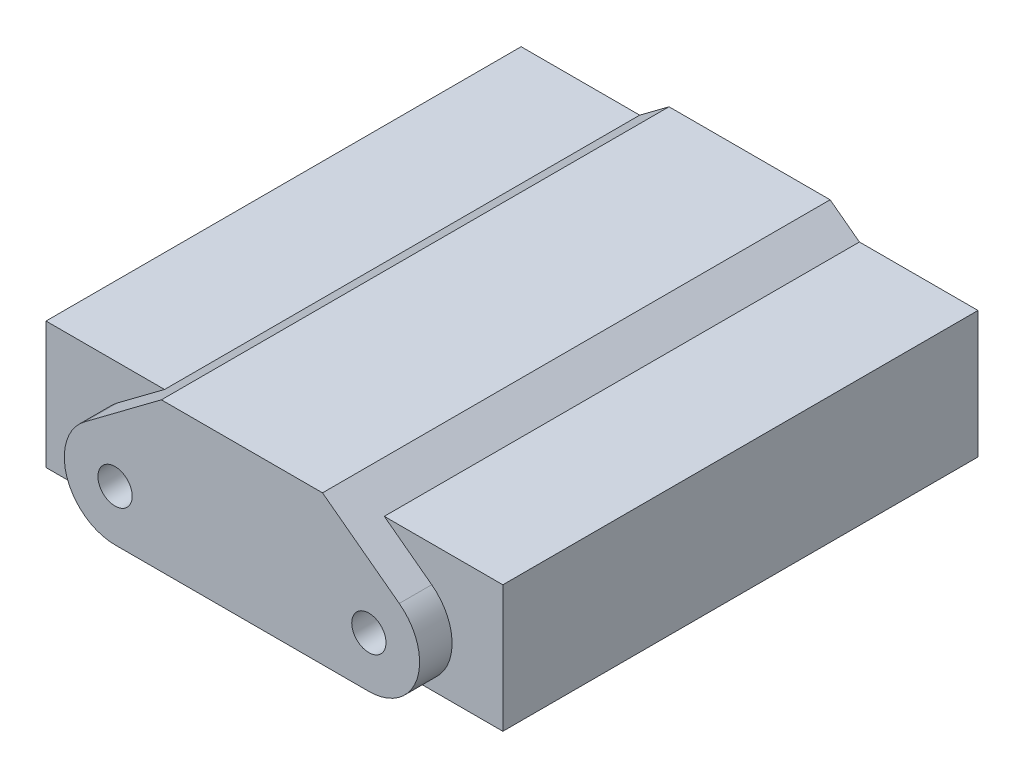
ISO-10303-21;
HEADER;
FILE_DESCRIPTION(('STEP AP214'),'2;1');
FILE_NAME('part.step','',(''),(''),'','','');
FILE_SCHEMA(('AUTOMOTIVE_DESIGN { 1 0 10303 214 1 1 1 1 }'));
ENDSEC;
DATA;
#1=APPLICATION_CONTEXT('core data for automotive mechanical design processes');
#2=APPLICATION_PROTOCOL_DEFINITION('international standard','automotive_design',2000,#1);
#3=PRODUCT_CONTEXT('',#1,'mechanical');
#4=PRODUCT('Part','Part','',(#3));
#5=PRODUCT_RELATED_PRODUCT_CATEGORY('part','',(#4));
#6=PRODUCT_DEFINITION_FORMATION('','',#4);
#7=PRODUCT_DEFINITION_CONTEXT('part definition',#1,'design');
#8=PRODUCT_DEFINITION('design','',#6,#7);
#9=PRODUCT_DEFINITION_SHAPE('','',#8);
#10=(LENGTH_UNIT() NAMED_UNIT(*) SI_UNIT(.MILLI.,.METRE.));
#11=(NAMED_UNIT(*) PLANE_ANGLE_UNIT() SI_UNIT($,.RADIAN.));
#12=(NAMED_UNIT(*) SI_UNIT($,.STERADIAN.) SOLID_ANGLE_UNIT());
#13=UNCERTAINTY_MEASURE_WITH_UNIT(LENGTH_MEASURE(1.E-05),#10,'distance_accuracy_value','');
#14=(GEOMETRIC_REPRESENTATION_CONTEXT(3) GLOBAL_UNCERTAINTY_ASSIGNED_CONTEXT((#13)) GLOBAL_UNIT_ASSIGNED_CONTEXT((#10,
#11,#12)) REPRESENTATION_CONTEXT('',''));
#15=CARTESIAN_POINT('',(0.,0.,0.));
#16=DIRECTION('',(0.,0.,1.));
#17=DIRECTION('',(1.,0.,0.));
#18=AXIS2_PLACEMENT_3D('',#15,#16,#17);
#19=CARTESIAN_POINT('',(-10.,6.,37.4416644150983));
#20=DIRECTION('',(0.,0.,1.));
#21=DIRECTION('',(1.,0.,0.));
#22=AXIS2_PLACEMENT_3D('',#19,#20,#21);
#23=PLANE('',#22);
#24=DIRECTION('',(-1.,0.,0.));
#25=VECTOR('',#24,1.);
#26=CARTESIAN_POINT('',(-18.,-4.,37.4416644150983));
#27=LINE('',#26,#25);
#28=CARTESIAN_POINT('',(18.,-4.,37.4416644150983));
#29=VERTEX_POINT('',#28);
#30=CARTESIAN_POINT('',(10.,-4.,37.4416644150983));
#31=VERTEX_POINT('',#30);
#32=EDGE_CURVE('E214',#29,#31,#27,.T.);
#33=ORIENTED_EDGE('',*,*,#32,.F.);
#34=DIRECTION('',(0.,-1.,0.));
#35=VECTOR('',#34,1.);
#36=CARTESIAN_POINT('',(18.,6.,37.4416644150983));
#37=LINE('',#36,#35);
#38=CARTESIAN_POINT('',(18.,6.,37.4416644150983));
#39=VERTEX_POINT('',#38);
#40=EDGE_CURVE('E149',#39,#29,#37,.T.);
#41=ORIENTED_EDGE('',*,*,#40,.F.);
#42=DIRECTION('',(-1.,0.,0.));
#43=VECTOR('',#42,1.);
#44=CARTESIAN_POINT('',(18.,6.,37.4416644150983));
#45=LINE('',#44,#43);
#46=CARTESIAN_POINT('',(8.65659447883979,6.,37.4416644150983));
#47=VERTEX_POINT('',#46);
#48=EDGE_CURVE('E219',#39,#47,#45,.T.);
#49=ORIENTED_EDGE('',*,*,#48,.T.);
#50=DIRECTION('',(-0.800775417645543,0.598964715567292,0.));
#51=VECTOR('',#50,1.);
#52=CARTESIAN_POINT('',(6.34773271878964,7.7269844914305,37.4416644150983));
#53=LINE('',#52,#51);
#54=CARTESIAN_POINT('',(12.3958588622692,3.20310167058217,37.4416644150983));
#55=VERTEX_POINT('',#54);
#56=EDGE_CURVE('E160',#55,#47,#53,.T.);
#57=ORIENTED_EDGE('',*,*,#56,.F.);
#58=CARTESIAN_POINT('',(10.,0.,37.4416644150983));
#59=DIRECTION('',(0.,0.,1.));
#60=DIRECTION('',(1.,0.,0.));
#61=AXIS2_PLACEMENT_3D('',#58,#59,#60);
#62=CIRCLE('',#61,4.);
#63=EDGE_CURVE('E57',#31,#55,#62,.T.);
#64=ORIENTED_EDGE('',*,*,#63,.F.);
#65=EDGE_LOOP('',(#33,#41,#49,#57,#64));
#66=FACE_BOUND('',#65,.T.);
#67=ADVANCED_FACE('F33',(#66),#23,.T.);
#68=CARTESIAN_POINT('',(-10.,0.,40.));
#69=DIRECTION('',(0.,0.,1.));
#70=DIRECTION('',(1.,0.,0.));
#71=AXIS2_PLACEMENT_3D('',#68,#69,#70);
#72=PLANE('',#71);
#73=CARTESIAN_POINT('',(10.,0.,40.));
#74=DIRECTION('',(0.,0.,1.));
#75=DIRECTION('',(1.,0.,0.));
#76=AXIS2_PLACEMENT_3D('',#73,#74,#75);
#77=CIRCLE('',#76,1.35);
#78=CARTESIAN_POINT('',(11.35,0.,40.));
#79=VERTEX_POINT('',#78);
#80=EDGE_CURVE('E169',#79,#79,#77,.T.);
#81=ORIENTED_EDGE('',*,*,#80,.F.);
#82=EDGE_LOOP('',(#81));
#83=FACE_BOUND('',#82,.T.);
#84=CARTESIAN_POINT('',(-10.,0.,40.));
#85=DIRECTION('',(0.,0.,1.));
#86=DIRECTION('',(1.,0.,0.));
#87=AXIS2_PLACEMENT_3D('',#84,#85,#86);
#88=CIRCLE('',#87,4.);
#89=CARTESIAN_POINT('',(-12.3958588622692,3.20310167058217,40.));
#90=VERTEX_POINT('',#89);
#91=CARTESIAN_POINT('',(-10.,-4.,40.));
#92=VERTEX_POINT('',#91);
#93=EDGE_CURVE('E173',#90,#92,#88,.T.);
#94=ORIENTED_EDGE('',*,*,#93,.T.);
#95=DIRECTION('',(1.,0.,0.));
#96=VECTOR('',#95,1.);
#97=CARTESIAN_POINT('',(-10.,-4.,40.));
#98=LINE('',#97,#96);
#99=CARTESIAN_POINT('',(10.,-4.,40.));
#100=VERTEX_POINT('',#99);
#101=EDGE_CURVE('E176',#92,#100,#98,.T.);
#102=ORIENTED_EDGE('',*,*,#101,.T.);
#103=CARTESIAN_POINT('',(10.,0.,40.));
#104=DIRECTION('',(0.,0.,1.));
#105=DIRECTION('',(1.,0.,0.));
#106=AXIS2_PLACEMENT_3D('',#103,#104,#105);
#107=CIRCLE('',#106,4.);
#108=CARTESIAN_POINT('',(12.3958588622692,3.20310167058217,40.));
#109=VERTEX_POINT('',#108);
#110=EDGE_CURVE('E179',#100,#109,#107,.T.);
#111=ORIENTED_EDGE('',*,*,#110,.T.);
#112=DIRECTION('',(-0.800775417645543,0.598964715567292,0.));
#113=VECTOR('',#112,1.);
#114=CARTESIAN_POINT('',(6.34773271878964,7.7269844914305,40.));
#115=LINE('',#114,#113);
#116=CARTESIAN_POINT('',(6.34773271878964,7.7269844914305,40.));
#117=VERTEX_POINT('',#116);
#118=EDGE_CURVE('E181',#109,#117,#115,.T.);
#119=ORIENTED_EDGE('',*,*,#118,.T.);
#120=DIRECTION('',(-1.,0.,0.));
#121=VECTOR('',#120,1.);
#122=CARTESIAN_POINT('',(0.,7.7269844914305,40.));
#123=LINE('',#122,#121);
#124=CARTESIAN_POINT('',(-6.34773271878964,7.7269844914305,40.));
#125=VERTEX_POINT('',#124);
#126=EDGE_CURVE('E183',#117,#125,#123,.T.);
#127=ORIENTED_EDGE('',*,*,#126,.T.);
#128=DIRECTION('',(-0.800775417645543,-0.598964715567291,0.));
#129=VECTOR('',#128,1.);
#130=CARTESIAN_POINT('',(-6.34773271878964,7.7269844914305,40.));
#131=LINE('',#130,#129);
#132=EDGE_CURVE('E185',#125,#90,#131,.T.);
#133=ORIENTED_EDGE('',*,*,#132,.T.);
#134=EDGE_LOOP('',(#94,#102,#111,#119,#127,#133));
#135=FACE_BOUND('',#134,.T.);
#136=CARTESIAN_POINT('',(-10.,0.,40.));
#137=DIRECTION('',(0.,0.,1.));
#138=DIRECTION('',(1.,0.,0.));
#139=AXIS2_PLACEMENT_3D('',#136,#137,#138);
#140=CIRCLE('',#139,1.35);
#141=CARTESIAN_POINT('',(-8.65,0.,40.));
#142=VERTEX_POINT('',#141);
#143=EDGE_CURVE('E166',#142,#142,#140,.T.);
#144=ORIENTED_EDGE('',*,*,#143,.F.);
#145=EDGE_LOOP('',(#144));
#146=FACE_BOUND('',#145,.T.);
#147=ADVANCED_FACE('F250',(#83,#135,#146),#72,.T.);
#148=CARTESIAN_POINT('',(-10.,0.,0.));
#149=DIRECTION('',(0.,0.,1.));
#150=DIRECTION('',(1.,0.,0.));
#151=AXIS2_PLACEMENT_3D('',#148,#149,#150);
#152=PLANE('',#151);
#153=CARTESIAN_POINT('',(10.,0.,0.));
#154=DIRECTION('',(0.,0.,-1.));
#155=DIRECTION('',(-1.,0.,0.));
#156=AXIS2_PLACEMENT_3D('',#153,#154,#155);
#157=CIRCLE('',#156,1.35);
#158=CARTESIAN_POINT('',(8.65,0.,0.));
#159=VERTEX_POINT('',#158);
#160=EDGE_CURVE('E354',#159,#159,#157,.T.);
#161=ORIENTED_EDGE('',*,*,#160,.F.);
#162=EDGE_LOOP('',(#161));
#163=FACE_BOUND('',#162,.T.);
#164=CARTESIAN_POINT('',(-10.,0.,0.));
#165=DIRECTION('',(0.,0.,-1.));
#166=DIRECTION('',(-1.,0.,0.));
#167=AXIS2_PLACEMENT_3D('',#164,#165,#166);
#168=CIRCLE('',#167,1.34);
#169=CARTESIAN_POINT('',(-11.34,0.,0.));
#170=VERTEX_POINT('',#169);
#171=EDGE_CURVE('E352',#170,#170,#168,.T.);
#172=ORIENTED_EDGE('',*,*,#171,.F.);
#173=EDGE_LOOP('',(#172));
#174=FACE_BOUND('',#173,.T.);
#175=DIRECTION('',(0.,-1.,0.));
#176=VECTOR('',#175,1.);
#177=CARTESIAN_POINT('',(18.,6.,0.));
#178=LINE('',#177,#176);
#179=CARTESIAN_POINT('',(18.,6.,0.));
#180=VERTEX_POINT('',#179);
#181=CARTESIAN_POINT('',(18.,-4.,0.));
#182=VERTEX_POINT('',#181);
#183=EDGE_CURVE('E140',#180,#182,#178,.T.);
#184=ORIENTED_EDGE('',*,*,#183,.T.);
#185=DIRECTION('',(1.,0.,0.));
#186=VECTOR('',#185,1.);
#187=CARTESIAN_POINT('',(18.,-4.,0.));
#188=LINE('',#187,#186);
#189=CARTESIAN_POINT('',(-18.,-4.,0.));
#190=VERTEX_POINT('',#189);
#191=EDGE_CURVE('E49',#190,#182,#188,.T.);
#192=ORIENTED_EDGE('',*,*,#191,.F.);
#193=DIRECTION('',(0.,-1.,0.));
#194=VECTOR('',#193,1.);
#195=CARTESIAN_POINT('',(-18.,6.,0.));
#196=LINE('',#195,#194);
#197=CARTESIAN_POINT('',(-18.,6.,0.));
#198=VERTEX_POINT('',#197);
#199=EDGE_CURVE('E137',#198,#190,#196,.T.);
#200=ORIENTED_EDGE('',*,*,#199,.F.);
#201=DIRECTION('',(1.,0.,0.));
#202=VECTOR('',#201,1.);
#203=CARTESIAN_POINT('',(-18.,6.,0.));
#204=LINE('',#203,#202);
#205=CARTESIAN_POINT('',(-8.65659447883979,6.,0.));
#206=VERTEX_POINT('',#205);
#207=EDGE_CURVE('E224',#198,#206,#204,.T.);
#208=ORIENTED_EDGE('',*,*,#207,.T.);
#209=DIRECTION('',(-0.800775417645543,-0.598964715567291,0.));
#210=VECTOR('',#209,1.);
#211=CARTESIAN_POINT('',(-6.34773271878964,7.7269844914305,0.));
#212=LINE('',#211,#210);
#213=CARTESIAN_POINT('',(-6.34773271878964,7.7269844914305,0.));
#214=VERTEX_POINT('',#213);
#215=EDGE_CURVE('E177',#214,#206,#212,.T.);
#216=ORIENTED_EDGE('',*,*,#215,.F.);
#217=DIRECTION('',(-1.,0.,0.));
#218=VECTOR('',#217,1.);
#219=CARTESIAN_POINT('',(0.,7.7269844914305,0.));
#220=LINE('',#219,#218);
#221=CARTESIAN_POINT('',(6.34773271878964,7.7269844914305,0.));
#222=VERTEX_POINT('',#221);
#223=EDGE_CURVE('E189',#222,#214,#220,.T.);
#224=ORIENTED_EDGE('',*,*,#223,.F.);
#225=DIRECTION('',(-0.800775417645543,0.598964715567292,0.));
#226=VECTOR('',#225,1.);
#227=CARTESIAN_POINT('',(6.34773271878964,7.7269844914305,0.));
#228=LINE('',#227,#226);
#229=CARTESIAN_POINT('',(8.65659447883979,6.,0.));
#230=VERTEX_POINT('',#229);
#231=EDGE_CURVE('E172',#230,#222,#228,.T.);
#232=ORIENTED_EDGE('',*,*,#231,.F.);
#233=EDGE_CURVE('E223',#230,#180,#204,.T.);
#234=ORIENTED_EDGE('',*,*,#233,.T.);
#235=EDGE_LOOP('',(#184,#192,#200,#208,#216,#224,#232,#234));
#236=FACE_BOUND('',#235,.T.);
#237=ADVANCED_FACE('F135',(#163,#174,#236),#152,.F.);
#238=CARTESIAN_POINT('',(-10.,0.,40.));
#239=DIRECTION('',(0.,0.,-1.));
#240=DIRECTION('',(-1.,0.,0.));
#241=AXIS2_PLACEMENT_3D('',#238,#239,#240);
#242=CYLINDRICAL_SURFACE('',#241,4.);
#243=DIRECTION('',(0.,0.,-1.));
#244=VECTOR('',#243,1.);
#245=CARTESIAN_POINT('',(-12.3958588622692,3.20310167058217,40.));
#246=LINE('',#245,#244);
#247=CARTESIAN_POINT('',(-12.3958588622692,3.20310167058217,37.4416644150983));
#248=VERTEX_POINT('',#247);
#249=EDGE_CURVE('E187',#90,#248,#246,.T.);
#250=ORIENTED_EDGE('',*,*,#249,.T.);
#251=CARTESIAN_POINT('',(-10.,0.,37.4416644150983));
#252=DIRECTION('',(0.,0.,1.));
#253=DIRECTION('',(1.,0.,0.));
#254=AXIS2_PLACEMENT_3D('',#251,#252,#253);
#255=CIRCLE('',#254,4.);
#256=CARTESIAN_POINT('',(-10.,-4.,37.4416644150983));
#257=VERTEX_POINT('',#256);
#258=EDGE_CURVE('E157',#248,#257,#255,.T.);
#259=ORIENTED_EDGE('',*,*,#258,.T.);
#260=DIRECTION('',(0.,0.,-1.));
#261=VECTOR('',#260,1.);
#262=CARTESIAN_POINT('',(-10.,-4.,40.));
#263=LINE('',#262,#261);
#264=EDGE_CURVE('E42',#92,#257,#263,.T.);
#265=ORIENTED_EDGE('',*,*,#264,.F.);
#266=ORIENTED_EDGE('',*,*,#93,.F.);
#267=EDGE_LOOP('',(#250,#259,#265,#266));
#268=FACE_BOUND('',#267,.T.);
#269=ADVANCED_FACE('F35',(#268),#242,.T.);
#270=CARTESIAN_POINT('',(-10.,-4.,40.));
#271=DIRECTION('',(0.,1.,0.));
#272=DIRECTION('',(0.,0.,1.));
#273=AXIS2_PLACEMENT_3D('',#270,#271,#272);
#274=PLANE('',#273);
#275=ORIENTED_EDGE('',*,*,#264,.T.);
#276=CARTESIAN_POINT('',(-18.,-4.,37.4416644150983));
#277=VERTEX_POINT('',#276);
#278=EDGE_CURVE('E126',#257,#277,#27,.T.);
#279=ORIENTED_EDGE('',*,*,#278,.T.);
#280=DIRECTION('',(0.,0.,-1.));
#281=VECTOR('',#280,1.);
#282=CARTESIAN_POINT('',(-18.,-4.,0.));
#283=LINE('',#282,#281);
#284=EDGE_CURVE('E123',#277,#190,#283,.T.);
#285=ORIENTED_EDGE('',*,*,#284,.T.);
#286=ORIENTED_EDGE('',*,*,#191,.T.);
#287=DIRECTION('',(0.,0.,1.));
#288=VECTOR('',#287,1.);
#289=CARTESIAN_POINT('',(18.,-4.,37.4416644150983));
#290=LINE('',#289,#288);
#291=EDGE_CURVE('E141',#182,#29,#290,.T.);
#292=ORIENTED_EDGE('',*,*,#291,.T.);
#293=ORIENTED_EDGE('',*,*,#32,.T.);
#294=DIRECTION('',(0.,0.,-1.));
#295=VECTOR('',#294,1.);
#296=CARTESIAN_POINT('',(10.,-4.,40.));
#297=LINE('',#296,#295);
#298=EDGE_CURVE('E202',#100,#31,#297,.T.);
#299=ORIENTED_EDGE('',*,*,#298,.F.);
#300=ORIENTED_EDGE('',*,*,#101,.F.);
#301=EDGE_LOOP('',(#275,#279,#285,#286,#292,#293,#299,#300));
#302=FACE_BOUND('',#301,.T.);
#303=ADVANCED_FACE('F125',(#302),#274,.F.);
#304=CARTESIAN_POINT('',(10.,0.,40.));
#305=DIRECTION('',(0.,0.,-1.));
#306=DIRECTION('',(-1.,0.,0.));
#307=AXIS2_PLACEMENT_3D('',#304,#305,#306);
#308=CYLINDRICAL_SURFACE('',#307,4.);
#309=ORIENTED_EDGE('',*,*,#298,.T.);
#310=ORIENTED_EDGE('',*,*,#63,.T.);
#311=DIRECTION('',(0.,0.,-1.));
#312=VECTOR('',#311,1.);
#313=CARTESIAN_POINT('',(12.3958588622692,3.20310167058217,40.));
#314=LINE('',#313,#312);
#315=EDGE_CURVE('E200',#109,#55,#314,.T.);
#316=ORIENTED_EDGE('',*,*,#315,.F.);
#317=ORIENTED_EDGE('',*,*,#110,.F.);
#318=EDGE_LOOP('',(#309,#310,#316,#317));
#319=FACE_BOUND('',#318,.T.);
#320=ADVANCED_FACE('F253',(#319),#308,.T.);
#321=CARTESIAN_POINT('',(6.34773271878964,7.7269844914305,40.));
#322=DIRECTION('',(-0.598964715567292,-0.800775417645543,0.));
#323=DIRECTION('',(0.800775417645543,-0.598964715567292,0.));
#324=AXIS2_PLACEMENT_3D('',#321,#322,#323);
#325=PLANE('',#324);
#326=ORIENTED_EDGE('',*,*,#315,.T.);
#327=ORIENTED_EDGE('',*,*,#56,.T.);
#328=DIRECTION('',(0.,0.,1.));
#329=VECTOR('',#328,1.);
#330=CARTESIAN_POINT('',(8.65659447883979,6.,40.));
#331=LINE('',#330,#329);
#332=EDGE_CURVE('E163',#230,#47,#331,.T.);
#333=ORIENTED_EDGE('',*,*,#332,.F.);
#334=ORIENTED_EDGE('',*,*,#231,.T.);
#335=DIRECTION('',(0.,0.,-1.));
#336=VECTOR('',#335,1.);
#337=CARTESIAN_POINT('',(6.34773271878964,7.7269844914305,40.));
#338=LINE('',#337,#336);
#339=EDGE_CURVE('E197',#117,#222,#338,.T.);
#340=ORIENTED_EDGE('',*,*,#339,.F.);
#341=ORIENTED_EDGE('',*,*,#118,.F.);
#342=EDGE_LOOP('',(#326,#327,#333,#334,#340,#341));
#343=FACE_BOUND('',#342,.T.);
#344=ADVANCED_FACE('F240',(#343),#325,.F.);
#345=CARTESIAN_POINT('',(0.,7.7269844914305,40.));
#346=DIRECTION('',(0.,-1.,0.));
#347=DIRECTION('',(0.,0.,-1.));
#348=AXIS2_PLACEMENT_3D('',#345,#346,#347);
#349=PLANE('',#348);
#350=ORIENTED_EDGE('',*,*,#223,.T.);
#351=DIRECTION('',(0.,0.,-1.));
#352=VECTOR('',#351,1.);
#353=CARTESIAN_POINT('',(-6.34773271878964,7.7269844914305,40.));
#354=LINE('',#353,#352);
#355=EDGE_CURVE('E194',#125,#214,#354,.T.);
#356=ORIENTED_EDGE('',*,*,#355,.F.);
#357=ORIENTED_EDGE('',*,*,#126,.F.);
#358=ORIENTED_EDGE('',*,*,#339,.T.);
#359=EDGE_LOOP('',(#350,#356,#357,#358));
#360=FACE_BOUND('',#359,.T.);
#361=ADVANCED_FACE('F247',(#360),#349,.F.);
#362=CARTESIAN_POINT('',(-6.34773271878964,7.7269844914305,40.));
#363=DIRECTION('',(0.598964715567291,-0.800775417645543,0.));
#364=DIRECTION('',(0.800775417645543,0.598964715567291,0.));
#365=AXIS2_PLACEMENT_3D('',#362,#363,#364);
#366=PLANE('',#365);
#367=DIRECTION('',(0.,0.,-1.));
#368=VECTOR('',#367,1.);
#369=CARTESIAN_POINT('',(-8.65659447883979,6.,40.));
#370=LINE('',#369,#368);
#371=CARTESIAN_POINT('',(-8.65659447883979,6.,37.4416644150983));
#372=VERTEX_POINT('',#371);
#373=EDGE_CURVE('E11',#372,#206,#370,.T.);
#374=ORIENTED_EDGE('',*,*,#373,.F.);
#375=DIRECTION('',(-0.800775417645543,-0.598964715567291,0.));
#376=VECTOR('',#375,1.);
#377=CARTESIAN_POINT('',(-6.34773271878964,7.7269844914305,37.4416644150983));
#378=LINE('',#377,#376);
#379=EDGE_CURVE('E155',#372,#248,#378,.T.);
#380=ORIENTED_EDGE('',*,*,#379,.T.);
#381=ORIENTED_EDGE('',*,*,#249,.F.);
#382=ORIENTED_EDGE('',*,*,#132,.F.);
#383=ORIENTED_EDGE('',*,*,#355,.T.);
#384=ORIENTED_EDGE('',*,*,#215,.T.);
#385=EDGE_LOOP('',(#374,#380,#381,#382,#383,#384));
#386=FACE_BOUND('',#385,.T.);
#387=ADVANCED_FACE('F295',(#386),#366,.F.);
#388=CARTESIAN_POINT('',(10.,0.,40.));
#389=DIRECTION('',(0.,0.,-1.));
#390=DIRECTION('',(-1.,0.,0.));
#391=AXIS2_PLACEMENT_3D('',#388,#389,#390);
#392=CYLINDRICAL_SURFACE('',#391,1.35);
#393=ORIENTED_EDGE('',*,*,#80,.T.);
#394=EDGE_LOOP('',(#393));
#395=FACE_BOUND('',#394,.T.);
#396=ORIENTED_EDGE('',*,*,#160,.T.);
#397=EDGE_LOOP('',(#396));
#398=FACE_BOUND('',#397,.T.);
#399=ADVANCED_FACE('F290',(#395,#398),#392,.F.);
#400=CARTESIAN_POINT('',(-10.,0.,40.));
#401=DIRECTION('',(0.,0.,-1.));
#402=DIRECTION('',(-1.,0.,0.));
#403=AXIS2_PLACEMENT_3D('',#400,#401,#402);
#404=CYLINDRICAL_SURFACE('',#403,1.35);
#405=ORIENTED_EDGE('',*,*,#143,.T.);
#406=EDGE_LOOP('',(#405));
#407=FACE_BOUND('',#406,.T.);
#408=CARTESIAN_POINT('',(-10.,0.,25.4416644150983));
#409=DIRECTION('',(0.,0.,1.));
#410=DIRECTION('',(1.,0.,0.));
#411=AXIS2_PLACEMENT_3D('',#408,#409,#410);
#412=CIRCLE('',#411,1.35);
#413=CARTESIAN_POINT('',(-8.65,0.,25.4416644150983));
#414=VERTEX_POINT('',#413);
#415=EDGE_CURVE('E131',#414,#414,#412,.T.);
#416=ORIENTED_EDGE('',*,*,#415,.F.);
#417=EDGE_LOOP('',(#416));
#418=FACE_BOUND('',#417,.T.);
#419=ADVANCED_FACE('F286',(#407,#418),#404,.F.);
#420=CARTESIAN_POINT('',(-18.,6.,37.4416644150983));
#421=DIRECTION('',(-1.,0.,0.));
#422=DIRECTION('',(0.,0.,1.));
#423=AXIS2_PLACEMENT_3D('',#420,#421,#422);
#424=PLANE('',#423);
#425=ORIENTED_EDGE('',*,*,#284,.F.);
#426=DIRECTION('',(0.,-1.,0.));
#427=VECTOR('',#426,1.);
#428=CARTESIAN_POINT('',(-18.,6.,37.4416644150983));
#429=LINE('',#428,#427);
#430=CARTESIAN_POINT('',(-18.,6.,37.4416644150983));
#431=VERTEX_POINT('',#430);
#432=EDGE_CURVE('E147',#431,#277,#429,.T.);
#433=ORIENTED_EDGE('',*,*,#432,.F.);
#434=DIRECTION('',(0.,0.,-1.));
#435=VECTOR('',#434,1.);
#436=CARTESIAN_POINT('',(-18.,6.,37.4416644150983));
#437=LINE('',#436,#435);
#438=EDGE_CURVE('E146',#431,#198,#437,.T.);
#439=ORIENTED_EDGE('',*,*,#438,.T.);
#440=ORIENTED_EDGE('',*,*,#199,.T.);
#441=EDGE_LOOP('',(#425,#433,#439,#440));
#442=FACE_BOUND('',#441,.T.);
#443=ADVANCED_FACE('F144',(#442),#424,.T.);
#444=CARTESIAN_POINT('',(0.,6.,0.));
#445=DIRECTION('',(0.,-1.,0.));
#446=DIRECTION('',(0.,0.,-1.));
#447=AXIS2_PLACEMENT_3D('',#444,#445,#446);
#448=PLANE('',#447);
#449=EDGE_CURVE('E216',#372,#431,#45,.T.);
#450=ORIENTED_EDGE('',*,*,#449,.F.);
#451=ORIENTED_EDGE('',*,*,#373,.T.);
#452=ORIENTED_EDGE('',*,*,#207,.F.);
#453=ORIENTED_EDGE('',*,*,#438,.F.);
#454=EDGE_LOOP('',(#450,#451,#452,#453));
#455=FACE_BOUND('',#454,.T.);
#456=ADVANCED_FACE('F277',(#455),#448,.F.);
#457=ORIENTED_EDGE('',*,*,#233,.F.);
#458=ORIENTED_EDGE('',*,*,#332,.T.);
#459=ORIENTED_EDGE('',*,*,#48,.F.);
#460=DIRECTION('',(0.,0.,1.));
#461=VECTOR('',#460,1.);
#462=CARTESIAN_POINT('',(18.,6.,0.));
#463=LINE('',#462,#461);
#464=EDGE_CURVE('E151',#180,#39,#463,.T.);
#465=ORIENTED_EDGE('',*,*,#464,.F.);
#466=EDGE_LOOP('',(#457,#458,#459,#465));
#467=FACE_BOUND('',#466,.T.);
#468=ADVANCED_FACE('F237',(#467),#448,.F.);
#469=ORIENTED_EDGE('',*,*,#278,.F.);
#470=ORIENTED_EDGE('',*,*,#258,.F.);
#471=ORIENTED_EDGE('',*,*,#379,.F.);
#472=ORIENTED_EDGE('',*,*,#449,.T.);
#473=ORIENTED_EDGE('',*,*,#432,.T.);
#474=EDGE_LOOP('',(#469,#470,#471,#472,#473));
#475=FACE_BOUND('',#474,.T.);
#476=ADVANCED_FACE('F212',(#475),#23,.T.);
#477=CARTESIAN_POINT('',(18.,6.,0.));
#478=DIRECTION('',(1.,0.,0.));
#479=DIRECTION('',(0.,0.,-1.));
#480=AXIS2_PLACEMENT_3D('',#477,#478,#479);
#481=PLANE('',#480);
#482=ORIENTED_EDGE('',*,*,#291,.F.);
#483=ORIENTED_EDGE('',*,*,#183,.F.);
#484=ORIENTED_EDGE('',*,*,#464,.T.);
#485=ORIENTED_EDGE('',*,*,#40,.T.);
#486=EDGE_LOOP('',(#482,#483,#484,#485));
#487=FACE_BOUND('',#486,.T.);
#488=ADVANCED_FACE('F229',(#487),#481,.T.);
#489=CARTESIAN_POINT('',(-10.,0.,25.4416644150983));
#490=DIRECTION('',(0.,0.,1.));
#491=DIRECTION('',(1.,0.,0.));
#492=AXIS2_PLACEMENT_3D('',#489,#490,#491);
#493=PLANE('',#492);
#494=CARTESIAN_POINT('',(-10.,0.,25.4416644150983));
#495=DIRECTION('',(0.,0.,1.));
#496=DIRECTION('',(1.,0.,0.));
#497=AXIS2_PLACEMENT_3D('',#494,#495,#496);
#498=CIRCLE('',#497,1.34);
#499=CARTESIAN_POINT('',(-8.66,0.,25.4416644150983));
#500=VERTEX_POINT('',#499);
#501=EDGE_CURVE('E37',#500,#500,#498,.T.);
#502=ORIENTED_EDGE('',*,*,#501,.F.);
#503=EDGE_LOOP('',(#502));
#504=FACE_BOUND('',#503,.T.);
#505=ORIENTED_EDGE('',*,*,#415,.T.);
#506=EDGE_LOOP('',(#505));
#507=FACE_BOUND('',#506,.T.);
#508=ADVANCED_FACE('F275',(#504,#507),#493,.T.);
#509=CARTESIAN_POINT('',(-10.,0.,52.));
#510=DIRECTION('',(0.,0.,-1.));
#511=DIRECTION('',(-1.,0.,0.));
#512=AXIS2_PLACEMENT_3D('',#509,#510,#511);
#513=CYLINDRICAL_SURFACE('',#512,1.34);
#514=ORIENTED_EDGE('',*,*,#501,.T.);
#515=EDGE_LOOP('',(#514));
#516=FACE_BOUND('',#515,.T.);
#517=ORIENTED_EDGE('',*,*,#171,.T.);
#518=EDGE_LOOP('',(#517));
#519=FACE_BOUND('',#518,.T.);
#520=ADVANCED_FACE('F335',(#516,#519),#513,.F.);
#521=CLOSED_SHELL('',(#67,#147,#237,#269,#303,#320,#344,#361,#387,#399,#419,#443,#456,#468,#476,
#488,#508,#520));
#522=MANIFOLD_SOLID_BREP('B2',#521);
#523=ADVANCED_BREP_SHAPE_REPRESENTATION('',(#18,#522),#14);
#524=SHAPE_DEFINITION_REPRESENTATION(#9,#523);
ENDSEC;
END-ISO-10303-21;
